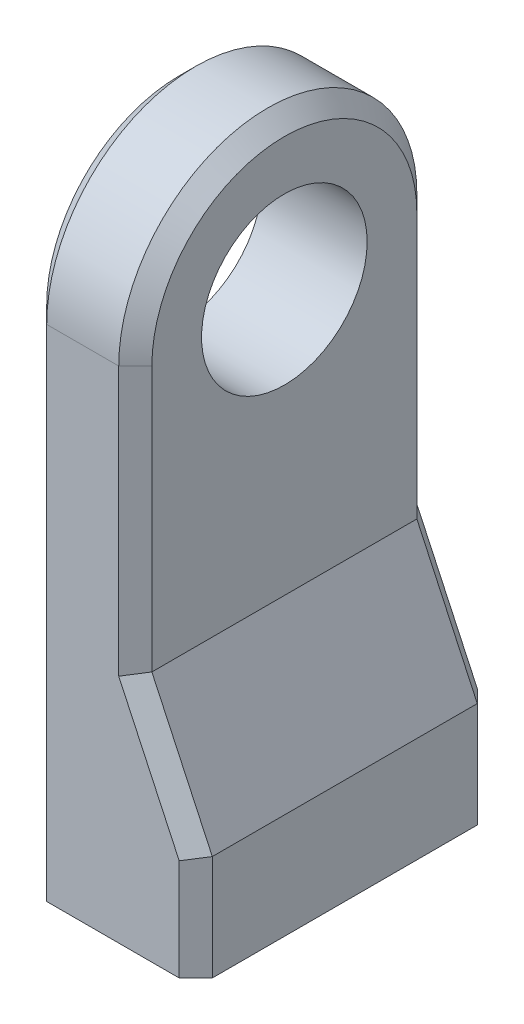
ISO-10303-21;
HEADER;
FILE_DESCRIPTION(('STEP AP214'),'2;1');
FILE_NAME('part.step','',(''),(''),'','','');
FILE_SCHEMA(('AUTOMOTIVE_DESIGN { 1 0 10303 214 1 1 1 1 }'));
ENDSEC;
DATA;
#1=APPLICATION_CONTEXT('core data for automotive mechanical design processes');
#2=APPLICATION_PROTOCOL_DEFINITION('international standard','automotive_design',2000,#1);
#3=PRODUCT_CONTEXT('',#1,'mechanical');
#4=PRODUCT('Part','Part','',(#3));
#5=PRODUCT_RELATED_PRODUCT_CATEGORY('part','',(#4));
#6=PRODUCT_DEFINITION_FORMATION('','',#4);
#7=PRODUCT_DEFINITION_CONTEXT('part definition',#1,'design');
#8=PRODUCT_DEFINITION('design','',#6,#7);
#9=PRODUCT_DEFINITION_SHAPE('','',#8);
#10=(LENGTH_UNIT() NAMED_UNIT(*) SI_UNIT(.MILLI.,.METRE.));
#11=(NAMED_UNIT(*) PLANE_ANGLE_UNIT() SI_UNIT($,.RADIAN.));
#12=(NAMED_UNIT(*) SI_UNIT($,.STERADIAN.) SOLID_ANGLE_UNIT());
#13=UNCERTAINTY_MEASURE_WITH_UNIT(LENGTH_MEASURE(1.E-05),#10,'distance_accuracy_value','');
#14=(GEOMETRIC_REPRESENTATION_CONTEXT(3) GLOBAL_UNCERTAINTY_ASSIGNED_CONTEXT((#13)) GLOBAL_UNIT_ASSIGNED_CONTEXT((#10,
#11,#12)) REPRESENTATION_CONTEXT('',''));
#15=CARTESIAN_POINT('',(0.,0.,0.));
#16=DIRECTION('',(0.,0.,1.));
#17=DIRECTION('',(1.,0.,0.));
#18=AXIS2_PLACEMENT_3D('',#15,#16,#17);
#19=CARTESIAN_POINT('',(10.,30.175,9.));
#20=DIRECTION('',(1.,0.,0.));
#21=DIRECTION('',(0.,0.,-1.));
#22=AXIS2_PLACEMENT_3D('',#19,#20,#21);
#23=PLANE('',#22);
#24=DIRECTION('',(0.,0.,-1.));
#25=VECTOR('',#24,1.);
#26=CARTESIAN_POINT('',(10.,6.35,24.));
#27=LINE('',#26,#25);
#28=CARTESIAN_POINT('',(10.,6.35,17.));
#29=VERTEX_POINT('',#28);
#30=CARTESIAN_POINT('',(10.,6.35,1.00000000000001));
#31=VERTEX_POINT('',#30);
#32=EDGE_CURVE('E224',#29,#31,#27,.T.);
#33=ORIENTED_EDGE('',*,*,#32,.F.);
#34=DIRECTION('',(0.,-1.,0.));
#35=VECTOR('',#34,1.);
#36=CARTESIAN_POINT('',(10.,0.,17.));
#37=LINE('',#36,#35);
#38=CARTESIAN_POINT('',(10.,0.,17.));
#39=VERTEX_POINT('',#38);
#40=EDGE_CURVE('E203',#29,#39,#37,.T.);
#41=ORIENTED_EDGE('',*,*,#40,.T.);
#42=DIRECTION('',(0.,0.,-1.));
#43=VECTOR('',#42,1.);
#44=CARTESIAN_POINT('',(10.,0.,18.));
#45=LINE('',#44,#43);
#46=CARTESIAN_POINT('',(10.,0.,1.00000000000001));
#47=VERTEX_POINT('',#46);
#48=EDGE_CURVE('E289',#39,#47,#45,.T.);
#49=ORIENTED_EDGE('',*,*,#48,.T.);
#50=DIRECTION('',(0.,1.,0.));
#51=VECTOR('',#50,1.);
#52=CARTESIAN_POINT('',(10.,6.34999999999999,1.00000000000001));
#53=LINE('',#52,#51);
#54=EDGE_CURVE('E166',#47,#31,#53,.T.);
#55=ORIENTED_EDGE('',*,*,#54,.T.);
#56=EDGE_LOOP('',(#33,#41,#49,#55));
#57=FACE_BOUND('',#56,.T.);
#58=ADVANCED_FACE('F47',(#57),#23,.T.);
#59=CARTESIAN_POINT('',(10.,30.175,9.));
#60=DIRECTION('',(-1.,0.,0.));
#61=DIRECTION('',(0.,0.,1.));
#62=AXIS2_PLACEMENT_3D('',#59,#60,#61);
#63=CYLINDRICAL_SURFACE('',#62,9.);
#64=DIRECTION('',(-1.,0.,0.));
#65=VECTOR('',#64,1.);
#66=CARTESIAN_POINT('',(10.,30.175,0.));
#67=LINE('',#66,#65);
#68=CARTESIAN_POINT('',(5.35,30.175,0.));
#69=VERTEX_POINT('',#68);
#70=CARTESIAN_POINT('',(1.00000000000001,30.175,0.));
#71=VERTEX_POINT('',#70);
#72=EDGE_CURVE('E163',#69,#71,#67,.T.);
#73=ORIENTED_EDGE('',*,*,#72,.T.);
#74=CARTESIAN_POINT('',(1.00000000000001,30.175,9.));
#75=DIRECTION('',(1.,0.,0.));
#76=DIRECTION('',(0.,0.,-1.));
#77=AXIS2_PLACEMENT_3D('',#74,#75,#76);
#78=CIRCLE('',#77,9.);
#79=CARTESIAN_POINT('',(1.00000000000001,30.175,18.));
#80=VERTEX_POINT('',#79);
#81=EDGE_CURVE('E198',#71,#80,#78,.T.);
#82=ORIENTED_EDGE('',*,*,#81,.T.);
#83=DIRECTION('',(-1.,0.,0.));
#84=VECTOR('',#83,1.);
#85=CARTESIAN_POINT('',(10.,30.175,18.));
#86=LINE('',#85,#84);
#87=CARTESIAN_POINT('',(5.35,30.175,18.));
#88=VERTEX_POINT('',#87);
#89=EDGE_CURVE('E300',#88,#80,#86,.T.);
#90=ORIENTED_EDGE('',*,*,#89,.F.);
#91=CARTESIAN_POINT('',(5.35,30.175,9.));
#92=DIRECTION('',(1.,0.,0.));
#93=DIRECTION('',(0.,0.,-1.));
#94=AXIS2_PLACEMENT_3D('',#91,#92,#93);
#95=CIRCLE('',#94,9.);
#96=EDGE_CURVE('E195',#88,#69,#95,.F.);
#97=ORIENTED_EDGE('',*,*,#96,.T.);
#98=EDGE_LOOP('',(#73,#82,#90,#97));
#99=FACE_BOUND('',#98,.T.);
#100=ADVANCED_FACE('F353',(#99),#63,.T.);
#101=CARTESIAN_POINT('',(10.,30.175,18.));
#102=DIRECTION('',(0.,0.,-1.));
#103=DIRECTION('',(0.,1.,0.));
#104=AXIS2_PLACEMENT_3D('',#101,#102,#103);
#105=PLANE('',#104);
#106=ORIENTED_EDGE('',*,*,#89,.T.);
#107=DIRECTION('',(0.,-1.,0.));
#108=VECTOR('',#107,1.);
#109=CARTESIAN_POINT('',(1.00000000000001,30.175,18.));
#110=LINE('',#109,#108);
#111=CARTESIAN_POINT('',(1.00000000000001,0.,18.));
#112=VERTEX_POINT('',#111);
#113=EDGE_CURVE('E192',#80,#112,#110,.T.);
#114=ORIENTED_EDGE('',*,*,#113,.T.);
#115=DIRECTION('',(-1.,0.,0.));
#116=VECTOR('',#115,1.);
#117=CARTESIAN_POINT('',(10.,0.,18.));
#118=LINE('',#117,#116);
#119=CARTESIAN_POINT('',(9.00000000000001,0.,18.));
#120=VERTEX_POINT('',#119);
#121=EDGE_CURVE('E162',#120,#112,#118,.T.);
#122=ORIENTED_EDGE('',*,*,#121,.F.);
#123=DIRECTION('',(0.,1.,0.));
#124=VECTOR('',#123,1.);
#125=CARTESIAN_POINT('',(9.00000000000001,6.35,18.));
#126=LINE('',#125,#124);
#127=CARTESIAN_POINT('',(9.00000000000001,6.12830533735707,18.));
#128=VERTEX_POINT('',#127);
#129=EDGE_CURVE('E189',#120,#128,#126,.T.);
#130=ORIENTED_EDGE('',*,*,#129,.T.);
#131=DIRECTION('',(-0.422618261740694,0.906307787036653,0.));
#132=VECTOR('',#131,1.);
#133=CARTESIAN_POINT('',(5.44369221296335,13.7548319981193,18.));
#134=LINE('',#133,#132);
#135=CARTESIAN_POINT('',(5.35,13.9557555972171,18.));
#136=VERTEX_POINT('',#135);
#137=EDGE_CURVE('E186',#128,#136,#134,.T.);
#138=ORIENTED_EDGE('',*,*,#137,.T.);
#139=DIRECTION('',(0.,1.,0.));
#140=VECTOR('',#139,1.);
#141=CARTESIAN_POINT('',(5.35,30.175,18.));
#142=LINE('',#141,#140);
#143=EDGE_CURVE('E183',#136,#88,#142,.T.);
#144=ORIENTED_EDGE('',*,*,#143,.T.);
#145=EDGE_LOOP('',(#106,#114,#122,#130,#138,#144));
#146=FACE_BOUND('',#145,.T.);
#147=ADVANCED_FACE('F335',(#146),#105,.F.);
#148=CARTESIAN_POINT('',(10.,0.,0.));
#149=DIRECTION('',(0.,0.,1.));
#150=DIRECTION('',(1.,0.,0.));
#151=AXIS2_PLACEMENT_3D('',#148,#149,#150);
#152=PLANE('',#151);
#153=DIRECTION('',(-1.,0.,0.));
#154=VECTOR('',#153,1.);
#155=CARTESIAN_POINT('',(10.,0.,0.));
#156=LINE('',#155,#154);
#157=CARTESIAN_POINT('',(9.,0.,0.));
#158=VERTEX_POINT('',#157);
#159=CARTESIAN_POINT('',(1.00000000000001,0.,0.));
#160=VERTEX_POINT('',#159);
#161=EDGE_CURVE('E142',#158,#160,#156,.T.);
#162=ORIENTED_EDGE('',*,*,#161,.T.);
#163=DIRECTION('',(0.,1.,0.));
#164=VECTOR('',#163,1.);
#165=CARTESIAN_POINT('',(1.00000000000001,0.,0.));
#166=LINE('',#165,#164);
#167=EDGE_CURVE('E151',#160,#71,#166,.T.);
#168=ORIENTED_EDGE('',*,*,#167,.T.);
#169=ORIENTED_EDGE('',*,*,#72,.F.);
#170=DIRECTION('',(0.,-1.,0.));
#171=VECTOR('',#170,1.);
#172=CARTESIAN_POINT('',(5.35,14.17745025986,0.));
#173=LINE('',#172,#171);
#174=CARTESIAN_POINT('',(5.35,13.9557555972171,0.));
#175=VERTEX_POINT('',#174);
#176=EDGE_CURVE('E303',#69,#175,#173,.T.);
#177=ORIENTED_EDGE('',*,*,#176,.T.);
#178=DIRECTION('',(0.422618261740694,-0.906307787036653,0.));
#179=VECTOR('',#178,1.);
#180=CARTESIAN_POINT('',(9.09369221296335,5.9273817382593,0.));
#181=LINE('',#180,#179);
#182=CARTESIAN_POINT('',(9.,6.12830533735706,0.));
#183=VERTEX_POINT('',#182);
#184=EDGE_CURVE('E145',#175,#183,#181,.T.);
#185=ORIENTED_EDGE('',*,*,#184,.T.);
#186=DIRECTION('',(0.,-1.,0.));
#187=VECTOR('',#186,1.);
#188=CARTESIAN_POINT('',(9.,0.,0.));
#189=LINE('',#188,#187);
#190=EDGE_CURVE('E138',#183,#158,#189,.T.);
#191=ORIENTED_EDGE('',*,*,#190,.T.);
#192=EDGE_LOOP('',(#162,#168,#169,#177,#185,#191));
#193=FACE_BOUND('',#192,.T.);
#194=ADVANCED_FACE('F140',(#193),#152,.F.);
#195=CARTESIAN_POINT('',(10.,30.175,9.));
#196=DIRECTION('',(-1.,0.,0.));
#197=DIRECTION('',(0.,0.,1.));
#198=AXIS2_PLACEMENT_3D('',#195,#196,#197);
#199=CYLINDRICAL_SURFACE('',#198,5.00000000000001);
#200=CARTESIAN_POINT('',(0.,30.175,9.));
#201=DIRECTION('',(1.,0.,0.));
#202=DIRECTION('',(0.,0.,-1.));
#203=AXIS2_PLACEMENT_3D('',#200,#201,#202);
#204=CIRCLE('',#203,5.00000000000001);
#205=CARTESIAN_POINT('',(0.,30.175,3.99999999999999));
#206=VERTEX_POINT('',#205);
#207=EDGE_CURVE('E273',#206,#206,#204,.T.);
#208=ORIENTED_EDGE('',*,*,#207,.F.);
#209=EDGE_LOOP('',(#208));
#210=FACE_BOUND('',#209,.T.);
#211=CARTESIAN_POINT('',(6.35,30.175,9.));
#212=DIRECTION('',(1.,0.,0.));
#213=DIRECTION('',(0.,0.,-1.));
#214=AXIS2_PLACEMENT_3D('',#211,#212,#213);
#215=CIRCLE('',#214,5.00000000000001);
#216=CARTESIAN_POINT('',(6.35,30.175,3.99999999999999));
#217=VERTEX_POINT('',#216);
#218=EDGE_CURVE('E260',#217,#217,#215,.T.);
#219=ORIENTED_EDGE('',*,*,#218,.T.);
#220=EDGE_LOOP('',(#219));
#221=FACE_BOUND('',#220,.T.);
#222=ADVANCED_FACE('F373',(#210,#221),#199,.F.);
#223=CARTESIAN_POINT('',(0.,30.175,9.));
#224=DIRECTION('',(1.,0.,0.));
#225=DIRECTION('',(0.,0.,-1.));
#226=AXIS2_PLACEMENT_3D('',#223,#224,#225);
#227=PLANE('',#226);
#228=CARTESIAN_POINT('',(0.,30.175,9.));
#229=DIRECTION('',(1.,0.,0.));
#230=DIRECTION('',(0.,0.,-1.));
#231=AXIS2_PLACEMENT_3D('',#228,#229,#230);
#232=CIRCLE('',#231,7.99999999999998);
#233=CARTESIAN_POINT('',(0.,30.175,17.));
#234=VERTEX_POINT('',#233);
#235=CARTESIAN_POINT('',(0.,30.175,1.00000000000002));
#236=VERTEX_POINT('',#235);
#237=EDGE_CURVE('E311',#234,#236,#232,.F.);
#238=ORIENTED_EDGE('',*,*,#237,.T.);
#239=DIRECTION('',(0.,-1.,0.));
#240=VECTOR('',#239,1.);
#241=CARTESIAN_POINT('',(0.,30.175,1.00000000000001));
#242=LINE('',#241,#240);
#243=CARTESIAN_POINT('',(0.,0.,1.00000000000001));
#244=VERTEX_POINT('',#243);
#245=EDGE_CURVE('E169',#236,#244,#242,.T.);
#246=ORIENTED_EDGE('',*,*,#245,.T.);
#247=DIRECTION('',(0.,0.,-1.));
#248=VECTOR('',#247,1.);
#249=CARTESIAN_POINT('',(0.,0.,18.));
#250=LINE('',#249,#248);
#251=CARTESIAN_POINT('',(0.,0.,17.));
#252=VERTEX_POINT('',#251);
#253=EDGE_CURVE('E288',#252,#244,#250,.T.);
#254=ORIENTED_EDGE('',*,*,#253,.F.);
#255=DIRECTION('',(0.,1.,0.));
#256=VECTOR('',#255,1.);
#257=CARTESIAN_POINT('',(0.,30.175,17.));
#258=LINE('',#257,#256);
#259=EDGE_CURVE('E175',#252,#234,#258,.T.);
#260=ORIENTED_EDGE('',*,*,#259,.T.);
#261=EDGE_LOOP('',(#238,#246,#254,#260));
#262=FACE_BOUND('',#261,.T.);
#263=ORIENTED_EDGE('',*,*,#207,.T.);
#264=EDGE_LOOP('',(#263));
#265=FACE_BOUND('',#264,.T.);
#266=ADVANCED_FACE('F318',(#262,#265),#227,.F.);
#267=CARTESIAN_POINT('',(10.,0.,18.));
#268=DIRECTION('',(0.,1.,0.));
#269=DIRECTION('',(0.,0.,1.));
#270=AXIS2_PLACEMENT_3D('',#267,#268,#269);
#271=PLANE('',#270);
#272=CARTESIAN_POINT('',(5.,0.,3.99999999999999));
#273=DIRECTION('',(0.,-1.,0.));
#274=DIRECTION('',(0.,0.,-1.));
#275=AXIS2_PLACEMENT_3D('',#272,#273,#274);
#276=CIRCLE('',#275,2.);
#277=CARTESIAN_POINT('',(5.,0.,1.99999999999999));
#278=VERTEX_POINT('',#277);
#279=EDGE_CURVE('E274',#278,#278,#276,.T.);
#280=ORIENTED_EDGE('',*,*,#279,.F.);
#281=EDGE_LOOP('',(#280));
#282=FACE_BOUND('',#281,.T.);
#283=CARTESIAN_POINT('',(5.,0.,14.));
#284=DIRECTION('',(0.,-1.,0.));
#285=DIRECTION('',(0.,0.,-1.));
#286=AXIS2_PLACEMENT_3D('',#283,#284,#285);
#287=CIRCLE('',#286,2.);
#288=CARTESIAN_POINT('',(5.,0.,12.));
#289=VERTEX_POINT('',#288);
#290=EDGE_CURVE('E278',#289,#289,#287,.T.);
#291=ORIENTED_EDGE('',*,*,#290,.F.);
#292=EDGE_LOOP('',(#291));
#293=FACE_BOUND('',#292,.T.);
#294=ORIENTED_EDGE('',*,*,#253,.T.);
#295=DIRECTION('',(-0.707106781186544,0.,0.707106781186551));
#296=VECTOR('',#295,1.);
#297=CARTESIAN_POINT('',(1.00000000000001,0.,0.));
#298=LINE('',#297,#296);
#299=EDGE_CURVE('E160',#244,#160,#298,.F.);
#300=ORIENTED_EDGE('',*,*,#299,.T.);
#301=ORIENTED_EDGE('',*,*,#161,.F.);
#302=DIRECTION('',(0.707106781186545,0.,0.70710678118655));
#303=VECTOR('',#302,1.);
#304=CARTESIAN_POINT('',(10.,0.,1.00000000000001));
#305=LINE('',#304,#303);
#306=EDGE_CURVE('E157',#158,#47,#305,.T.);
#307=ORIENTED_EDGE('',*,*,#306,.T.);
#308=ORIENTED_EDGE('',*,*,#48,.F.);
#309=DIRECTION('',(-0.707106781186547,0.,0.707106781186548));
#310=VECTOR('',#309,1.);
#311=CARTESIAN_POINT('',(10.,0.,17.));
#312=LINE('',#311,#310);
#313=EDGE_CURVE('E168',#39,#120,#312,.T.);
#314=ORIENTED_EDGE('',*,*,#313,.T.);
#315=ORIENTED_EDGE('',*,*,#121,.T.);
#316=DIRECTION('',(0.707106781186544,0.,0.707106781186551));
#317=VECTOR('',#316,1.);
#318=CARTESIAN_POINT('',(1.00000000000001,0.,18.));
#319=LINE('',#318,#317);
#320=EDGE_CURVE('E173',#112,#252,#319,.F.);
#321=ORIENTED_EDGE('',*,*,#320,.T.);
#322=EDGE_LOOP('',(#294,#300,#301,#307,#308,#314,#315,#321));
#323=FACE_BOUND('',#322,.T.);
#324=ADVANCED_FACE('F155',(#282,#293,#323),#271,.F.);
#325=CARTESIAN_POINT('',(5.,10.,14.));
#326=DIRECTION('',(0.,-1.,0.));
#327=DIRECTION('',(0.,0.,-1.));
#328=AXIS2_PLACEMENT_3D('',#325,#326,#327);
#329=CYLINDRICAL_SURFACE('',#328,2.);
#330=CARTESIAN_POINT('',(5.,10.,14.));
#331=DIRECTION('',(0.,-1.,0.));
#332=DIRECTION('',(0.,0.,-1.));
#333=AXIS2_PLACEMENT_3D('',#330,#331,#332);
#334=CIRCLE('',#333,2.);
#335=CARTESIAN_POINT('',(5.,10.,12.));
#336=VERTEX_POINT('',#335);
#337=EDGE_CURVE('E265',#336,#336,#334,.T.);
#338=ORIENTED_EDGE('',*,*,#337,.F.);
#339=EDGE_LOOP('',(#338));
#340=FACE_BOUND('',#339,.T.);
#341=ORIENTED_EDGE('',*,*,#290,.T.);
#342=EDGE_LOOP('',(#341));
#343=FACE_BOUND('',#342,.T.);
#344=ADVANCED_FACE('F381',(#340,#343),#329,.F.);
#345=CARTESIAN_POINT('',(5.,10.,14.));
#346=DIRECTION('',(0.,-1.,0.));
#347=DIRECTION('',(0.,0.,-1.));
#348=AXIS2_PLACEMENT_3D('',#345,#346,#347);
#349=PLANE('',#348);
#350=ORIENTED_EDGE('',*,*,#337,.T.);
#351=EDGE_LOOP('',(#350));
#352=FACE_BOUND('',#351,.T.);
#353=ADVANCED_FACE('F537',(#352),#349,.T.);
#354=CARTESIAN_POINT('',(5.,10.,3.99999999999999));
#355=DIRECTION('',(0.,-1.,0.));
#356=DIRECTION('',(0.,0.,-1.));
#357=AXIS2_PLACEMENT_3D('',#354,#355,#356);
#358=CYLINDRICAL_SURFACE('',#357,2.);
#359=CARTESIAN_POINT('',(5.,10.,3.99999999999999));
#360=DIRECTION('',(0.,-1.,0.));
#361=DIRECTION('',(0.,0.,-1.));
#362=AXIS2_PLACEMENT_3D('',#359,#360,#361);
#363=CIRCLE('',#362,2.);
#364=CARTESIAN_POINT('',(5.,10.,1.99999999999999));
#365=VERTEX_POINT('',#364);
#366=EDGE_CURVE('E269',#365,#365,#363,.T.);
#367=ORIENTED_EDGE('',*,*,#366,.F.);
#368=EDGE_LOOP('',(#367));
#369=FACE_BOUND('',#368,.T.);
#370=ORIENTED_EDGE('',*,*,#279,.T.);
#371=EDGE_LOOP('',(#370));
#372=FACE_BOUND('',#371,.T.);
#373=ADVANCED_FACE('F528',(#369,#372),#358,.F.);
#374=CARTESIAN_POINT('',(5.,10.,3.99999999999999));
#375=DIRECTION('',(0.,-1.,0.));
#376=DIRECTION('',(0.,0.,-1.));
#377=AXIS2_PLACEMENT_3D('',#374,#375,#376);
#378=PLANE('',#377);
#379=ORIENTED_EDGE('',*,*,#366,.T.);
#380=EDGE_LOOP('',(#379));
#381=FACE_BOUND('',#380,.T.);
#382=ADVANCED_FACE('F490',(#381),#378,.T.);
#383=CARTESIAN_POINT('',(10.,6.35,24.));
#384=DIRECTION('',(0.906307787036652,0.422618261740694,0.));
#385=DIRECTION('',(-0.422618261740694,0.906307787036653,0.));
#386=AXIS2_PLACEMENT_3D('',#383,#384,#385);
#387=PLANE('',#386);
#388=DIRECTION('',(0.,0.,-1.));
#389=VECTOR('',#388,1.);
#390=CARTESIAN_POINT('',(6.35,14.17745025986,24.));
#391=LINE('',#390,#389);
#392=CARTESIAN_POINT('',(6.35,14.17745025986,17.));
#393=VERTEX_POINT('',#392);
#394=CARTESIAN_POINT('',(6.35,14.17745025986,1.00000000000001));
#395=VERTEX_POINT('',#394);
#396=EDGE_CURVE('E254',#393,#395,#391,.T.);
#397=ORIENTED_EDGE('',*,*,#396,.F.);
#398=DIRECTION('',(0.422618261740694,-0.906307787036653,0.));
#399=VECTOR('',#398,1.);
#400=CARTESIAN_POINT('',(10.,6.35,17.));
#401=LINE('',#400,#399);
#402=EDGE_CURVE('E210',#393,#29,#401,.T.);
#403=ORIENTED_EDGE('',*,*,#402,.T.);
#404=ORIENTED_EDGE('',*,*,#32,.T.);
#405=DIRECTION('',(-0.422618261740694,0.906307787036653,0.));
#406=VECTOR('',#405,1.);
#407=CARTESIAN_POINT('',(6.35,14.17745025986,1.00000000000001));
#408=LINE('',#407,#406);
#409=EDGE_CURVE('E207',#31,#395,#408,.T.);
#410=ORIENTED_EDGE('',*,*,#409,.T.);
#411=EDGE_LOOP('',(#397,#403,#404,#410));
#412=FACE_BOUND('',#411,.T.);
#413=ADVANCED_FACE('F253',(#412),#387,.T.);
#414=CARTESIAN_POINT('',(6.35,14.17745025986,24.));
#415=DIRECTION('',(1.,0.,0.));
#416=DIRECTION('',(0.,0.,-1.));
#417=AXIS2_PLACEMENT_3D('',#414,#415,#416);
#418=PLANE('',#417);
#419=ORIENTED_EDGE('',*,*,#218,.F.);
#420=EDGE_LOOP('',(#419));
#421=FACE_BOUND('',#420,.T.);
#422=CARTESIAN_POINT('',(6.35,30.175,9.));
#423=DIRECTION('',(1.,0.,0.));
#424=DIRECTION('',(0.,0.,-1.));
#425=AXIS2_PLACEMENT_3D('',#422,#423,#424);
#426=CIRCLE('',#425,7.99999999999999);
#427=CARTESIAN_POINT('',(6.35,30.175,1.00000000000001));
#428=VERTEX_POINT('',#427);
#429=CARTESIAN_POINT('',(6.35,30.175,17.));
#430=VERTEX_POINT('',#429);
#431=EDGE_CURVE('E58',#428,#430,#426,.T.);
#432=ORIENTED_EDGE('',*,*,#431,.T.);
#433=DIRECTION('',(0.,-1.,0.));
#434=VECTOR('',#433,1.);
#435=CARTESIAN_POINT('',(6.35,14.17745025986,17.));
#436=LINE('',#435,#434);
#437=EDGE_CURVE('E11',#430,#393,#436,.T.);
#438=ORIENTED_EDGE('',*,*,#437,.T.);
#439=ORIENTED_EDGE('',*,*,#396,.T.);
#440=DIRECTION('',(0.,1.,0.));
#441=VECTOR('',#440,1.);
#442=CARTESIAN_POINT('',(6.35,30.175,1.00000000000001));
#443=LINE('',#442,#441);
#444=EDGE_CURVE('E69',#395,#428,#443,.T.);
#445=ORIENTED_EDGE('',*,*,#444,.T.);
#446=EDGE_LOOP('',(#432,#438,#439,#445));
#447=FACE_BOUND('',#446,.T.);
#448=ADVANCED_FACE('F257',(#421,#447),#418,.T.);
#449=CARTESIAN_POINT('',(1.00000000000001,30.175,18.));
#450=DIRECTION('',(0.707106781186551,0.,-0.707106781186544));
#451=DIRECTION('',(0.,-1.,0.));
#452=AXIS2_PLACEMENT_3D('',#449,#450,#451);
#453=PLANE('',#452);
#454=ORIENTED_EDGE('',*,*,#320,.F.);
#455=ORIENTED_EDGE('',*,*,#113,.F.);
#456=DIRECTION('',(0.707106781186544,0.,0.707106781186551));
#457=VECTOR('',#456,1.);
#458=CARTESIAN_POINT('',(0.,30.175,17.));
#459=LINE('',#458,#457);
#460=EDGE_CURVE('E220',#234,#80,#459,.T.);
#461=ORIENTED_EDGE('',*,*,#460,.F.);
#462=ORIENTED_EDGE('',*,*,#259,.F.);
#463=EDGE_LOOP('',(#454,#455,#461,#462));
#464=FACE_BOUND('',#463,.T.);
#465=ADVANCED_FACE('F325',(#464),#453,.F.);
#466=CARTESIAN_POINT('',(1.00000000000001,30.175,9.));
#467=DIRECTION('',(1.,0.,0.));
#468=DIRECTION('',(0.,0.,-1.));
#469=AXIS2_PLACEMENT_3D('',#466,#467,#468);
#470=CONICAL_SURFACE('',#469,9.,0.785398163397453);
#471=ORIENTED_EDGE('',*,*,#460,.T.);
#472=ORIENTED_EDGE('',*,*,#81,.F.);
#473=DIRECTION('',(0.707106781186544,0.,-0.707106781186551));
#474=VECTOR('',#473,1.);
#475=CARTESIAN_POINT('',(0.,30.175,1.00000000000002));
#476=LINE('',#475,#474);
#477=EDGE_CURVE('E217',#236,#71,#476,.T.);
#478=ORIENTED_EDGE('',*,*,#477,.F.);
#479=ORIENTED_EDGE('',*,*,#237,.F.);
#480=EDGE_LOOP('',(#471,#472,#478,#479));
#481=FACE_BOUND('',#480,.T.);
#482=ADVANCED_FACE('F329',(#481),#470,.T.);
#483=CARTESIAN_POINT('',(1.00000000000001,0.,0.));
#484=DIRECTION('',(0.707106781186551,0.,0.707106781186544));
#485=DIRECTION('',(0.,1.,0.));
#486=AXIS2_PLACEMENT_3D('',#483,#484,#485);
#487=PLANE('',#486);
#488=ORIENTED_EDGE('',*,*,#299,.F.);
#489=ORIENTED_EDGE('',*,*,#245,.F.);
#490=ORIENTED_EDGE('',*,*,#477,.T.);
#491=ORIENTED_EDGE('',*,*,#167,.F.);
#492=EDGE_LOOP('',(#488,#489,#490,#491));
#493=FACE_BOUND('',#492,.T.);
#494=ADVANCED_FACE('F331',(#493),#487,.F.);
#495=CARTESIAN_POINT('',(10.,30.175,1.00000000000001));
#496=DIRECTION('',(0.70710678118655,0.,-0.707106781186545));
#497=DIRECTION('',(0.,-1.,0.));
#498=AXIS2_PLACEMENT_3D('',#495,#496,#497);
#499=PLANE('',#498);
#500=ORIENTED_EDGE('',*,*,#306,.F.);
#501=ORIENTED_EDGE('',*,*,#190,.F.);
#502=DIRECTION('',(-0.698575389024275,-0.154870435200396,-0.698575389024279));
#503=VECTOR('',#502,1.);
#504=CARTESIAN_POINT('',(9.6466165641756,6.2716567784113,0.646616564175607));
#505=LINE('',#504,#503);
#506=EDGE_CURVE('E52',#31,#183,#505,.T.);
#507=ORIENTED_EDGE('',*,*,#506,.F.);
#508=ORIENTED_EDGE('',*,*,#54,.F.);
#509=EDGE_LOOP('',(#500,#501,#507,#508));
#510=FACE_BOUND('',#509,.T.);
#511=ADVANCED_FACE('F50',(#510),#499,.T.);
#512=CARTESIAN_POINT('',(11.5258833198661,0.711531077504513,0.));
#513=DIRECTION('',(0.640856382055792,0.298836238730117,-0.707106781186545));
#514=DIRECTION('',(-0.422618261740694,0.906307787036653,0.));
#515=AXIS2_PLACEMENT_3D('',#512,#513,#514);
#516=PLANE('',#515);
#517=ORIENTED_EDGE('',*,*,#506,.T.);
#518=ORIENTED_EDGE('',*,*,#184,.F.);
#519=DIRECTION('',(-0.698575389024275,-0.154870435200396,-0.698575389024279));
#520=VECTOR('',#519,1.);
#521=CARTESIAN_POINT('',(6.93100274135107,14.3062554665985,1.58100274135108));
#522=LINE('',#521,#520);
#523=EDGE_CURVE('E240',#395,#175,#522,.T.);
#524=ORIENTED_EDGE('',*,*,#523,.F.);
#525=ORIENTED_EDGE('',*,*,#409,.F.);
#526=EDGE_LOOP('',(#517,#518,#524,#525));
#527=FACE_BOUND('',#526,.T.);
#528=ADVANCED_FACE('F249',(#527),#516,.T.);
#529=CARTESIAN_POINT('',(5.35,0.,0.));
#530=DIRECTION('',(0.70710678118655,0.,-0.707106781186545));
#531=DIRECTION('',(0.,1.,0.));
#532=AXIS2_PLACEMENT_3D('',#529,#530,#531);
#533=PLANE('',#532);
#534=ORIENTED_EDGE('',*,*,#523,.T.);
#535=ORIENTED_EDGE('',*,*,#176,.F.);
#536=DIRECTION('',(-0.707106781186545,0.,-0.70710678118655));
#537=VECTOR('',#536,1.);
#538=CARTESIAN_POINT('',(6.35,30.175,1.00000000000001));
#539=LINE('',#538,#537);
#540=EDGE_CURVE('E237',#428,#69,#539,.T.);
#541=ORIENTED_EDGE('',*,*,#540,.F.);
#542=ORIENTED_EDGE('',*,*,#444,.F.);
#543=EDGE_LOOP('',(#534,#535,#541,#542));
#544=FACE_BOUND('',#543,.T.);
#545=ADVANCED_FACE('F354',(#544),#533,.T.);
#546=CARTESIAN_POINT('',(6.35,30.175,9.));
#547=DIRECTION('',(-1.,0.,0.));
#548=DIRECTION('',(0.,0.,1.));
#549=AXIS2_PLACEMENT_3D('',#546,#547,#548);
#550=CONICAL_SURFACE('',#549,7.99999999999999,0.785398163397452);
#551=ORIENTED_EDGE('',*,*,#540,.T.);
#552=ORIENTED_EDGE('',*,*,#96,.F.);
#553=DIRECTION('',(-0.707106781186545,0.,0.70710678118655));
#554=VECTOR('',#553,1.);
#555=CARTESIAN_POINT('',(6.35,30.175,17.));
#556=LINE('',#555,#554);
#557=EDGE_CURVE('E233',#430,#88,#556,.T.);
#558=ORIENTED_EDGE('',*,*,#557,.F.);
#559=ORIENTED_EDGE('',*,*,#431,.F.);
#560=EDGE_LOOP('',(#551,#552,#558,#559));
#561=FACE_BOUND('',#560,.T.);
#562=ADVANCED_FACE('F350',(#561),#550,.T.);
#563=CARTESIAN_POINT('',(6.35,14.17745025986,17.));
#564=DIRECTION('',(0.707106781186551,0.,0.707106781186544));
#565=DIRECTION('',(0.,1.,0.));
#566=AXIS2_PLACEMENT_3D('',#563,#564,#565);
#567=PLANE('',#566);
#568=ORIENTED_EDGE('',*,*,#557,.T.);
#569=ORIENTED_EDGE('',*,*,#143,.F.);
#570=DIRECTION('',(0.698575389024273,0.154870435200404,-0.698575389024279));
#571=VECTOR('',#570,1.);
#572=CARTESIAN_POINT('',(7.28438617717541,14.3845986881872,16.0656138228246));
#573=LINE('',#572,#571);
#574=EDGE_CURVE('E229',#393,#136,#573,.F.);
#575=ORIENTED_EDGE('',*,*,#574,.F.);
#576=ORIENTED_EDGE('',*,*,#437,.F.);
#577=EDGE_LOOP('',(#568,#569,#575,#576));
#578=FACE_BOUND('',#577,.T.);
#579=ADVANCED_FACE('F347',(#578),#567,.T.);
#580=CARTESIAN_POINT('',(10.,6.35,17.));
#581=DIRECTION('',(0.640856382055791,0.298836238730116,0.707106781186546));
#582=DIRECTION('',(-0.422618261740694,0.906307787036653,0.));
#583=AXIS2_PLACEMENT_3D('',#580,#581,#582);
#584=PLANE('',#583);
#585=ORIENTED_EDGE('',*,*,#574,.T.);
#586=ORIENTED_EDGE('',*,*,#137,.F.);
#587=DIRECTION('',(0.698575389024277,0.154870435200393,-0.698575389024278));
#588=VECTOR('',#587,1.);
#589=CARTESIAN_POINT('',(10.,6.35,17.));
#590=LINE('',#589,#588);
#591=EDGE_CURVE('E225',#29,#128,#590,.F.);
#592=ORIENTED_EDGE('',*,*,#591,.F.);
#593=ORIENTED_EDGE('',*,*,#402,.F.);
#594=EDGE_LOOP('',(#585,#586,#592,#593));
#595=FACE_BOUND('',#594,.T.);
#596=ADVANCED_FACE('F343',(#595),#584,.T.);
#597=CARTESIAN_POINT('',(10.,30.175,17.));
#598=DIRECTION('',(0.707106781186548,0.,0.707106781186547));
#599=DIRECTION('',(0.,1.,0.));
#600=AXIS2_PLACEMENT_3D('',#597,#598,#599);
#601=PLANE('',#600);
#602=ORIENTED_EDGE('',*,*,#591,.T.);
#603=ORIENTED_EDGE('',*,*,#129,.F.);
#604=ORIENTED_EDGE('',*,*,#313,.F.);
#605=ORIENTED_EDGE('',*,*,#40,.F.);
#606=EDGE_LOOP('',(#602,#603,#604,#605));
#607=FACE_BOUND('',#606,.T.);
#608=ADVANCED_FACE('F338',(#607),#601,.T.);
#609=CLOSED_SHELL('',(#58,#100,#147,#194,#222,#266,#324,#344,#353,#373,#382,#413,#448,#465,#482,
#494,#511,#528,#545,#562,#579,#596,#608));
#610=MANIFOLD_SOLID_BREP('B2',#609);
#611=ADVANCED_BREP_SHAPE_REPRESENTATION('',(#18,#610),#14);
#612=SHAPE_DEFINITION_REPRESENTATION(#9,#611);
ENDSEC;
END-ISO-10303-21;
